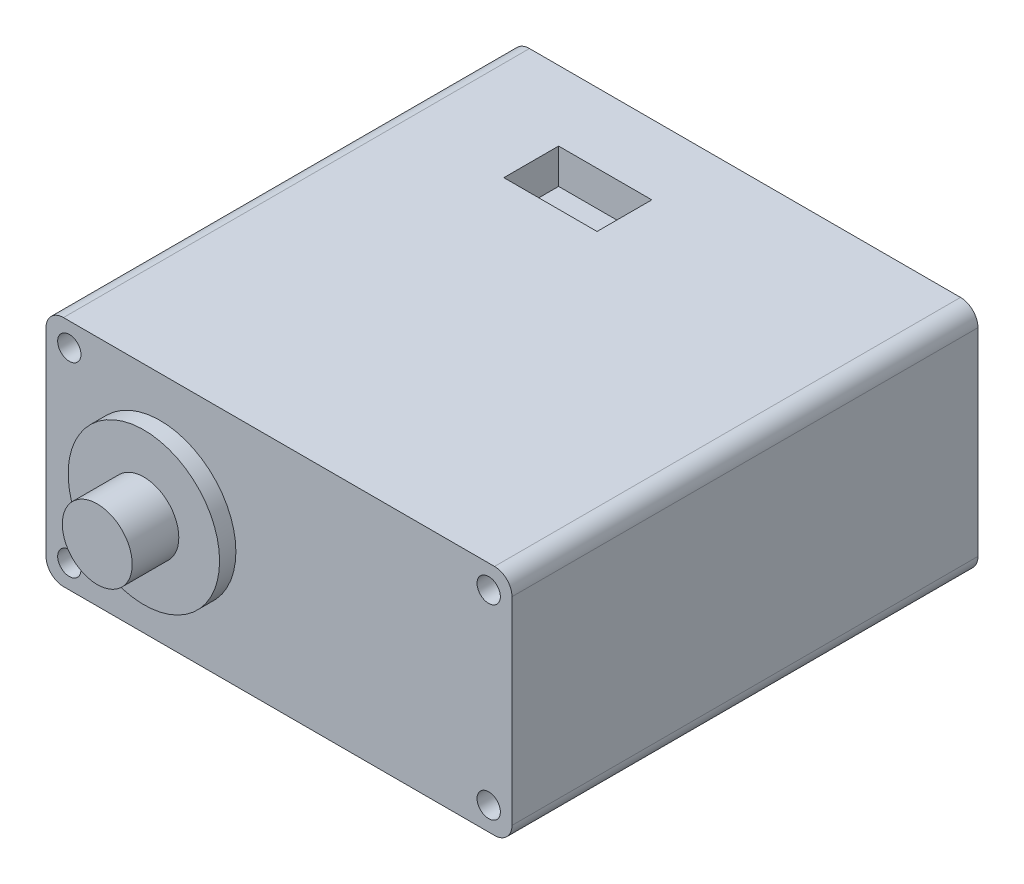
ISO-10303-21;
HEADER;
FILE_DESCRIPTION(('STEP AP214'),'2;1');
FILE_NAME('part.step','',(''),(''),'','','');
FILE_SCHEMA(('AUTOMOTIVE_DESIGN { 1 0 10303 214 1 1 1 1 }'));
ENDSEC;
DATA;
#1=APPLICATION_CONTEXT('core data for automotive mechanical design processes');
#2=APPLICATION_PROTOCOL_DEFINITION('international standard','automotive_design',2000,#1);
#3=PRODUCT_CONTEXT('',#1,'mechanical');
#4=PRODUCT('Part','Part','',(#3));
#5=PRODUCT_RELATED_PRODUCT_CATEGORY('part','',(#4));
#6=PRODUCT_DEFINITION_FORMATION('','',#4);
#7=PRODUCT_DEFINITION_CONTEXT('part definition',#1,'design');
#8=PRODUCT_DEFINITION('design','',#6,#7);
#9=PRODUCT_DEFINITION_SHAPE('','',#8);
#10=(LENGTH_UNIT() NAMED_UNIT(*) SI_UNIT(.MILLI.,.METRE.));
#11=(NAMED_UNIT(*) PLANE_ANGLE_UNIT() SI_UNIT($,.RADIAN.));
#12=(NAMED_UNIT(*) SI_UNIT($,.STERADIAN.) SOLID_ANGLE_UNIT());
#13=UNCERTAINTY_MEASURE_WITH_UNIT(LENGTH_MEASURE(1.E-05),#10,'distance_accuracy_value','');
#14=(GEOMETRIC_REPRESENTATION_CONTEXT(3) GLOBAL_UNCERTAINTY_ASSIGNED_CONTEXT((#13)) GLOBAL_UNIT_ASSIGNED_CONTEXT((#10,
#11,#12)) REPRESENTATION_CONTEXT('',''));
#15=CARTESIAN_POINT('',(0.,0.,0.));
#16=DIRECTION('',(0.,0.,1.));
#17=DIRECTION('',(1.,0.,0.));
#18=AXIS2_PLACEMENT_3D('',#15,#16,#17);
#19=CARTESIAN_POINT('',(-16.5753114594964,120.529011992891,40.));
#20=DIRECTION('',(0.,-1.,0.));
#21=DIRECTION('',(0.,0.,-1.));
#22=AXIS2_PLACEMENT_3D('',#19,#20,#21);
#23=PLANE('',#22);
#24=DIRECTION('',(-1.,0.,0.));
#25=VECTOR('',#24,1.);
#26=CARTESIAN_POINT('',(-16.5753114594964,120.529011992891,0.));
#27=LINE('',#26,#25);
#28=CARTESIAN_POINT('',(-18.0753114594964,120.529011992891,0.));
#29=VERTEX_POINT('',#28);
#30=CARTESIAN_POINT('',(-55.0753114594964,120.529011992891,0.));
#31=VERTEX_POINT('',#30);
#32=EDGE_CURVE('E332',#29,#31,#27,.T.);
#33=ORIENTED_EDGE('',*,*,#32,.T.);
#34=DIRECTION('',(0.,0.,-1.));
#35=VECTOR('',#34,1.);
#36=CARTESIAN_POINT('',(-55.0753114594964,120.529011992891,40.));
#37=LINE('',#36,#35);
#38=CARTESIAN_POINT('',(-55.0753114594964,120.529011992891,40.));
#39=VERTEX_POINT('',#38);
#40=EDGE_CURVE('E355',#31,#39,#37,.F.);
#41=ORIENTED_EDGE('',*,*,#40,.T.);
#42=DIRECTION('',(-1.,0.,0.));
#43=VECTOR('',#42,1.);
#44=CARTESIAN_POINT('',(-16.5753114594964,120.529011992891,40.));
#45=LINE('',#44,#43);
#46=CARTESIAN_POINT('',(-18.0753114594964,120.529011992891,40.));
#47=VERTEX_POINT('',#46);
#48=EDGE_CURVE('E319',#47,#39,#45,.T.);
#49=ORIENTED_EDGE('',*,*,#48,.F.);
#50=DIRECTION('',(0.,0.,-1.));
#51=VECTOR('',#50,1.);
#52=CARTESIAN_POINT('',(-18.0753114594964,120.529011992891,40.));
#53=LINE('',#52,#51);
#54=EDGE_CURVE('E352',#47,#29,#53,.T.);
#55=ORIENTED_EDGE('',*,*,#54,.T.);
#56=EDGE_LOOP('',(#33,#41,#49,#55));
#57=FACE_BOUND('',#56,.T.);
#58=DIRECTION('',(0.,0.,1.));
#59=VECTOR('',#58,1.);
#60=CARTESIAN_POINT('',(-38.5753114594964,120.529011992891,10.7));
#61=LINE('',#60,#59);
#62=CARTESIAN_POINT('',(-38.5753114594964,120.529011992891,6.));
#63=VERTEX_POINT('',#62);
#64=CARTESIAN_POINT('',(-38.5753114594964,120.529011992891,10.7));
#65=VERTEX_POINT('',#64);
#66=EDGE_CURVE('E66',#63,#65,#61,.T.);
#67=ORIENTED_EDGE('',*,*,#66,.T.);
#68=DIRECTION('',(-1.,0.,0.));
#69=VECTOR('',#68,1.);
#70=CARTESIAN_POINT('',(-46.5753114594964,120.529011992891,10.7));
#71=LINE('',#70,#69);
#72=CARTESIAN_POINT('',(-46.5753114594964,120.529011992891,10.7));
#73=VERTEX_POINT('',#72);
#74=EDGE_CURVE('E224',#65,#73,#71,.T.);
#75=ORIENTED_EDGE('',*,*,#74,.T.);
#76=DIRECTION('',(0.,0.,-1.));
#77=VECTOR('',#76,1.);
#78=CARTESIAN_POINT('',(-46.5753114594964,120.529011992891,10.7));
#79=LINE('',#78,#77);
#80=CARTESIAN_POINT('',(-46.5753114594964,120.529011992891,6.));
#81=VERTEX_POINT('',#80);
#82=EDGE_CURVE('E235',#73,#81,#79,.T.);
#83=ORIENTED_EDGE('',*,*,#82,.T.);
#84=DIRECTION('',(1.,0.,0.));
#85=VECTOR('',#84,1.);
#86=CARTESIAN_POINT('',(-46.5753114594964,120.529011992891,6.));
#87=LINE('',#86,#85);
#88=EDGE_CURVE('E232',#81,#63,#87,.T.);
#89=ORIENTED_EDGE('',*,*,#88,.T.);
#90=EDGE_LOOP('',(#67,#75,#83,#89));
#91=FACE_BOUND('',#90,.T.);
#92=ADVANCED_FACE('F42',(#57,#91),#23,.F.);
#93=CARTESIAN_POINT('',(0.,0.,40.));
#94=DIRECTION('',(0.,0.,1.));
#95=DIRECTION('',(1.,0.,0.));
#96=AXIS2_PLACEMENT_3D('',#93,#94,#95);
#97=PLANE('',#96);
#98=CARTESIAN_POINT('',(-46.7753114594964,110.529011992891,40.));
#99=DIRECTION('',(0.,0.,1.));
#100=DIRECTION('',(1.,0.,0.));
#101=AXIS2_PLACEMENT_3D('',#98,#99,#100);
#102=CIRCLE('',#101,6.5);
#103=CARTESIAN_POINT('',(-40.2753114594964,110.529011992891,40.));
#104=VERTEX_POINT('',#103);
#105=EDGE_CURVE('E285',#104,#104,#102,.T.);
#106=ORIENTED_EDGE('',*,*,#105,.F.);
#107=EDGE_LOOP('',(#106));
#108=FACE_BOUND('',#107,.T.);
#109=CARTESIAN_POINT('',(-18.5753114594964,102.529011992891,40.));
#110=DIRECTION('',(0.,0.,1.));
#111=DIRECTION('',(1.,0.,0.));
#112=AXIS2_PLACEMENT_3D('',#109,#110,#111);
#113=CIRCLE('',#112,0.999999999999998);
#114=CARTESIAN_POINT('',(-17.5753114594964,102.529011992891,40.));
#115=VERTEX_POINT('',#114);
#116=EDGE_CURVE('E298',#115,#115,#113,.T.);
#117=ORIENTED_EDGE('',*,*,#116,.F.);
#118=EDGE_LOOP('',(#117));
#119=FACE_BOUND('',#118,.T.);
#120=CARTESIAN_POINT('',(-54.5753114594964,118.529011992891,40.));
#121=DIRECTION('',(0.,0.,1.));
#122=DIRECTION('',(1.,0.,0.));
#123=AXIS2_PLACEMENT_3D('',#120,#121,#122);
#124=CIRCLE('',#123,0.999999999999998);
#125=CARTESIAN_POINT('',(-53.5753114594964,118.529011992891,40.));
#126=VERTEX_POINT('',#125);
#127=EDGE_CURVE('E310',#126,#126,#124,.T.);
#128=ORIENTED_EDGE('',*,*,#127,.F.);
#129=EDGE_LOOP('',(#128));
#130=FACE_BOUND('',#129,.T.);
#131=ORIENTED_EDGE('',*,*,#48,.T.);
#132=CARTESIAN_POINT('',(-55.0753114594964,119.029011992891,40.));
#133=DIRECTION('',(0.,0.,1.));
#134=DIRECTION('',(1.,0.,0.));
#135=AXIS2_PLACEMENT_3D('',#132,#133,#134);
#136=CIRCLE('',#135,1.5);
#137=CARTESIAN_POINT('',(-56.5753114594964,119.029011992891,40.));
#138=VERTEX_POINT('',#137);
#139=EDGE_CURVE('E363',#39,#138,#136,.T.);
#140=ORIENTED_EDGE('',*,*,#139,.T.);
#141=DIRECTION('',(0.,-1.,0.));
#142=VECTOR('',#141,1.);
#143=CARTESIAN_POINT('',(-56.5753114594964,100.529011992891,40.));
#144=LINE('',#143,#142);
#145=CARTESIAN_POINT('',(-56.5753114594964,102.029011992891,40.));
#146=VERTEX_POINT('',#145);
#147=EDGE_CURVE('E323',#138,#146,#144,.T.);
#148=ORIENTED_EDGE('',*,*,#147,.T.);
#149=CARTESIAN_POINT('',(-55.0753114594964,102.029011992891,40.));
#150=DIRECTION('',(0.,0.,1.));
#151=DIRECTION('',(1.,0.,0.));
#152=AXIS2_PLACEMENT_3D('',#149,#150,#151);
#153=CIRCLE('',#152,1.5);
#154=CARTESIAN_POINT('',(-55.0753114594964,100.529011992891,40.));
#155=VERTEX_POINT('',#154);
#156=EDGE_CURVE('E357',#146,#155,#153,.T.);
#157=ORIENTED_EDGE('',*,*,#156,.T.);
#158=DIRECTION('',(1.,0.,0.));
#159=VECTOR('',#158,1.);
#160=CARTESIAN_POINT('',(-16.5753114594964,100.529011992891,40.));
#161=LINE('',#160,#159);
#162=CARTESIAN_POINT('',(-18.0753114594964,100.529011992891,40.));
#163=VERTEX_POINT('',#162);
#164=EDGE_CURVE('E326',#155,#163,#161,.T.);
#165=ORIENTED_EDGE('',*,*,#164,.T.);
#166=CARTESIAN_POINT('',(-18.0753114594964,102.029011992891,40.));
#167=DIRECTION('',(0.,0.,1.));
#168=DIRECTION('',(1.,0.,0.));
#169=AXIS2_PLACEMENT_3D('',#166,#167,#168);
#170=CIRCLE('',#169,1.5);
#171=CARTESIAN_POINT('',(-16.5753114594964,102.029011992891,40.));
#172=VERTEX_POINT('',#171);
#173=EDGE_CURVE('E359',#163,#172,#170,.T.);
#174=ORIENTED_EDGE('',*,*,#173,.T.);
#175=DIRECTION('',(0.,1.,0.));
#176=VECTOR('',#175,1.);
#177=CARTESIAN_POINT('',(-16.5753114594964,100.529011992891,40.));
#178=LINE('',#177,#176);
#179=CARTESIAN_POINT('',(-16.5753114594964,119.029011992891,40.));
#180=VERTEX_POINT('',#179);
#181=EDGE_CURVE('E316',#172,#180,#178,.T.);
#182=ORIENTED_EDGE('',*,*,#181,.T.);
#183=CARTESIAN_POINT('',(-18.0753114594964,119.029011992891,40.));
#184=DIRECTION('',(0.,0.,1.));
#185=DIRECTION('',(1.,0.,0.));
#186=AXIS2_PLACEMENT_3D('',#183,#184,#185);
#187=CIRCLE('',#186,1.5);
#188=EDGE_CURVE('E361',#180,#47,#187,.T.);
#189=ORIENTED_EDGE('',*,*,#188,.T.);
#190=EDGE_LOOP('',(#131,#140,#148,#157,#165,#174,#182,#189));
#191=FACE_BOUND('',#190,.T.);
#192=CARTESIAN_POINT('',(-54.5753114594964,102.529011992891,40.));
#193=DIRECTION('',(0.,0.,1.));
#194=DIRECTION('',(1.,0.,0.));
#195=AXIS2_PLACEMENT_3D('',#192,#193,#194);
#196=CIRCLE('',#195,0.999999999999998);
#197=CARTESIAN_POINT('',(-53.5753114594964,102.529011992891,40.));
#198=VERTEX_POINT('',#197);
#199=EDGE_CURVE('E304',#198,#198,#196,.T.);
#200=ORIENTED_EDGE('',*,*,#199,.F.);
#201=EDGE_LOOP('',(#200));
#202=FACE_BOUND('',#201,.T.);
#203=CARTESIAN_POINT('',(-18.5753114594964,118.529011992891,40.));
#204=DIRECTION('',(0.,0.,1.));
#205=DIRECTION('',(1.,0.,0.));
#206=AXIS2_PLACEMENT_3D('',#203,#204,#205);
#207=CIRCLE('',#206,0.999999999999998);
#208=CARTESIAN_POINT('',(-17.5753114594964,118.529011992891,40.));
#209=VERTEX_POINT('',#208);
#210=EDGE_CURVE('E292',#209,#209,#207,.T.);
#211=ORIENTED_EDGE('',*,*,#210,.F.);
#212=EDGE_LOOP('',(#211));
#213=FACE_BOUND('',#212,.T.);
#214=ADVANCED_FACE('F385',(#108,#119,#130,#191,#202,#213),#97,.T.);
#215=CARTESIAN_POINT('',(0.,0.,0.));
#216=DIRECTION('',(0.,0.,1.));
#217=DIRECTION('',(1.,0.,0.));
#218=AXIS2_PLACEMENT_3D('',#215,#216,#217);
#219=PLANE('',#218);
#220=CARTESIAN_POINT('',(-46.7753114594964,110.529011992891,0.));
#221=DIRECTION('',(0.,0.,1.));
#222=DIRECTION('',(1.,0.,0.));
#223=AXIS2_PLACEMENT_3D('',#220,#221,#222);
#224=CIRCLE('',#223,6.50000000000001);
#225=CARTESIAN_POINT('',(-40.2753114594964,110.529011992891,0.));
#226=VERTEX_POINT('',#225);
#227=EDGE_CURVE('E46',#226,#226,#224,.F.);
#228=ORIENTED_EDGE('',*,*,#227,.F.);
#229=EDGE_LOOP('',(#228));
#230=FACE_BOUND('',#229,.T.);
#231=DIRECTION('',(0.,-1.,0.));
#232=VECTOR('',#231,1.);
#233=CARTESIAN_POINT('',(-56.5753114594964,100.529011992891,0.));
#234=LINE('',#233,#232);
#235=CARTESIAN_POINT('',(-56.5753114594964,119.029011992891,0.));
#236=VERTEX_POINT('',#235);
#237=CARTESIAN_POINT('',(-56.5753114594964,102.029011992891,0.));
#238=VERTEX_POINT('',#237);
#239=EDGE_CURVE('E335',#236,#238,#234,.T.);
#240=ORIENTED_EDGE('',*,*,#239,.F.);
#241=CARTESIAN_POINT('',(-55.0753114594964,119.029011992891,0.));
#242=DIRECTION('',(0.,0.,1.));
#243=DIRECTION('',(1.,0.,0.));
#244=AXIS2_PLACEMENT_3D('',#241,#242,#243);
#245=CIRCLE('',#244,1.5);
#246=EDGE_CURVE('E350',#236,#31,#245,.F.);
#247=ORIENTED_EDGE('',*,*,#246,.T.);
#248=ORIENTED_EDGE('',*,*,#32,.F.);
#249=CARTESIAN_POINT('',(-18.0753114594964,119.029011992891,0.));
#250=DIRECTION('',(0.,0.,1.));
#251=DIRECTION('',(1.,0.,0.));
#252=AXIS2_PLACEMENT_3D('',#249,#250,#251);
#253=CIRCLE('',#252,1.5);
#254=CARTESIAN_POINT('',(-16.5753114594964,119.029011992891,0.));
#255=VERTEX_POINT('',#254);
#256=EDGE_CURVE('E348',#29,#255,#253,.F.);
#257=ORIENTED_EDGE('',*,*,#256,.T.);
#258=DIRECTION('',(0.,1.,0.));
#259=VECTOR('',#258,1.);
#260=CARTESIAN_POINT('',(-16.5753114594964,100.529011992891,0.));
#261=LINE('',#260,#259);
#262=CARTESIAN_POINT('',(-16.5753114594964,102.029011992891,0.));
#263=VERTEX_POINT('',#262);
#264=EDGE_CURVE('E313',#263,#255,#261,.T.);
#265=ORIENTED_EDGE('',*,*,#264,.F.);
#266=CARTESIAN_POINT('',(-18.0753114594964,102.029011992891,0.));
#267=DIRECTION('',(0.,0.,1.));
#268=DIRECTION('',(1.,0.,0.));
#269=AXIS2_PLACEMENT_3D('',#266,#267,#268);
#270=CIRCLE('',#269,1.5);
#271=CARTESIAN_POINT('',(-18.0753114594964,100.529011992891,0.));
#272=VERTEX_POINT('',#271);
#273=EDGE_CURVE('E346',#263,#272,#270,.F.);
#274=ORIENTED_EDGE('',*,*,#273,.T.);
#275=DIRECTION('',(1.,0.,0.));
#276=VECTOR('',#275,1.);
#277=CARTESIAN_POINT('',(-16.5753114594964,100.529011992891,0.));
#278=LINE('',#277,#276);
#279=CARTESIAN_POINT('',(-55.0753114594964,100.529011992891,0.));
#280=VERTEX_POINT('',#279);
#281=EDGE_CURVE('E320',#280,#272,#278,.T.);
#282=ORIENTED_EDGE('',*,*,#281,.F.);
#283=CARTESIAN_POINT('',(-55.0753114594964,102.029011992891,0.));
#284=DIRECTION('',(0.,0.,1.));
#285=DIRECTION('',(1.,0.,0.));
#286=AXIS2_PLACEMENT_3D('',#283,#284,#285);
#287=CIRCLE('',#286,1.5);
#288=EDGE_CURVE('E344',#280,#238,#287,.F.);
#289=ORIENTED_EDGE('',*,*,#288,.T.);
#290=EDGE_LOOP('',(#240,#247,#248,#257,#265,#274,#282,#289));
#291=FACE_BOUND('',#290,.T.);
#292=CARTESIAN_POINT('',(-54.5753114594964,118.529011992891,0.));
#293=DIRECTION('',(0.,0.,1.));
#294=DIRECTION('',(1.,0.,0.));
#295=AXIS2_PLACEMENT_3D('',#292,#293,#294);
#296=CIRCLE('',#295,0.999999999999998);
#297=CARTESIAN_POINT('',(-53.5753114594964,118.529011992891,0.));
#298=VERTEX_POINT('',#297);
#299=EDGE_CURVE('E307',#298,#298,#296,.T.);
#300=ORIENTED_EDGE('',*,*,#299,.T.);
#301=EDGE_LOOP('',(#300));
#302=FACE_BOUND('',#301,.T.);
#303=CARTESIAN_POINT('',(-54.5753114594964,102.529011992891,0.));
#304=DIRECTION('',(0.,0.,1.));
#305=DIRECTION('',(1.,0.,0.));
#306=AXIS2_PLACEMENT_3D('',#303,#304,#305);
#307=CIRCLE('',#306,0.999999999999998);
#308=CARTESIAN_POINT('',(-53.5753114594964,102.529011992891,0.));
#309=VERTEX_POINT('',#308);
#310=EDGE_CURVE('E301',#309,#309,#307,.T.);
#311=ORIENTED_EDGE('',*,*,#310,.T.);
#312=EDGE_LOOP('',(#311));
#313=FACE_BOUND('',#312,.T.);
#314=CARTESIAN_POINT('',(-18.5753114594964,102.529011992891,0.));
#315=DIRECTION('',(0.,0.,1.));
#316=DIRECTION('',(1.,0.,0.));
#317=AXIS2_PLACEMENT_3D('',#314,#315,#316);
#318=CIRCLE('',#317,0.999999999999998);
#319=CARTESIAN_POINT('',(-17.5753114594964,102.529011992891,0.));
#320=VERTEX_POINT('',#319);
#321=EDGE_CURVE('E295',#320,#320,#318,.T.);
#322=ORIENTED_EDGE('',*,*,#321,.T.);
#323=EDGE_LOOP('',(#322));
#324=FACE_BOUND('',#323,.T.);
#325=CARTESIAN_POINT('',(-18.5753114594964,118.529011992891,0.));
#326=DIRECTION('',(0.,0.,1.));
#327=DIRECTION('',(1.,0.,0.));
#328=AXIS2_PLACEMENT_3D('',#325,#326,#327);
#329=CIRCLE('',#328,0.999999999999998);
#330=CARTESIAN_POINT('',(-17.5753114594964,118.529011992891,0.));
#331=VERTEX_POINT('',#330);
#332=EDGE_CURVE('E289',#331,#331,#329,.T.);
#333=ORIENTED_EDGE('',*,*,#332,.T.);
#334=EDGE_LOOP('',(#333));
#335=FACE_BOUND('',#334,.T.);
#336=ADVANCED_FACE('F381',(#230,#291,#302,#313,#324,#335),#219,.F.);
#337=CARTESIAN_POINT('',(-16.5753114594964,100.529011992891,40.));
#338=DIRECTION('',(-1.,0.,0.));
#339=DIRECTION('',(0.,0.,1.));
#340=AXIS2_PLACEMENT_3D('',#337,#338,#339);
#341=PLANE('',#340);
#342=ORIENTED_EDGE('',*,*,#264,.T.);
#343=DIRECTION('',(0.,0.,-1.));
#344=VECTOR('',#343,1.);
#345=CARTESIAN_POINT('',(-16.5753114594964,119.029011992891,40.));
#346=LINE('',#345,#344);
#347=EDGE_CURVE('E368',#255,#180,#346,.F.);
#348=ORIENTED_EDGE('',*,*,#347,.T.);
#349=ORIENTED_EDGE('',*,*,#181,.F.);
#350=DIRECTION('',(0.,0.,-1.));
#351=VECTOR('',#350,1.);
#352=CARTESIAN_POINT('',(-16.5753114594964,102.029011992891,40.));
#353=LINE('',#352,#351);
#354=EDGE_CURVE('E365',#172,#263,#353,.T.);
#355=ORIENTED_EDGE('',*,*,#354,.T.);
#356=EDGE_LOOP('',(#342,#348,#349,#355));
#357=FACE_BOUND('',#356,.T.);
#358=ADVANCED_FACE('F384',(#357),#341,.F.);
#359=CARTESIAN_POINT('',(-56.5753114594964,100.529011992891,40.));
#360=DIRECTION('',(1.,0.,0.));
#361=DIRECTION('',(0.,0.,-1.));
#362=AXIS2_PLACEMENT_3D('',#359,#360,#361);
#363=PLANE('',#362);
#364=DIRECTION('',(0.,0.,-1.));
#365=VECTOR('',#364,1.);
#366=CARTESIAN_POINT('',(-56.5753114594964,114.529011992891,6.));
#367=LINE('',#366,#365);
#368=CARTESIAN_POINT('',(-56.5753114594964,114.529011992891,10.7));
#369=VERTEX_POINT('',#368);
#370=CARTESIAN_POINT('',(-56.5753114594964,114.529011992891,6.));
#371=VERTEX_POINT('',#370);
#372=EDGE_CURVE('E211',#369,#371,#367,.T.);
#373=ORIENTED_EDGE('',*,*,#372,.F.);
#374=DIRECTION('',(0.,1.,0.));
#375=VECTOR('',#374,1.);
#376=CARTESIAN_POINT('',(-56.5753114594964,114.529011992891,10.7));
#377=LINE('',#376,#375);
#378=CARTESIAN_POINT('',(-56.5753114594964,106.529011992891,10.7));
#379=VERTEX_POINT('',#378);
#380=EDGE_CURVE('E58',#379,#369,#377,.T.);
#381=ORIENTED_EDGE('',*,*,#380,.F.);
#382=DIRECTION('',(0.,0.,1.));
#383=VECTOR('',#382,1.);
#384=CARTESIAN_POINT('',(-56.5753114594964,106.529011992891,6.));
#385=LINE('',#384,#383);
#386=CARTESIAN_POINT('',(-56.5753114594964,106.529011992891,6.));
#387=VERTEX_POINT('',#386);
#388=EDGE_CURVE('E202',#387,#379,#385,.T.);
#389=ORIENTED_EDGE('',*,*,#388,.F.);
#390=DIRECTION('',(0.,-1.,0.));
#391=VECTOR('',#390,1.);
#392=CARTESIAN_POINT('',(-56.5753114594964,114.529011992891,6.));
#393=LINE('',#392,#391);
#394=EDGE_CURVE('E205',#371,#387,#393,.T.);
#395=ORIENTED_EDGE('',*,*,#394,.F.);
#396=EDGE_LOOP('',(#373,#381,#389,#395));
#397=FACE_BOUND('',#396,.T.);
#398=ORIENTED_EDGE('',*,*,#147,.F.);
#399=DIRECTION('',(0.,0.,-1.));
#400=VECTOR('',#399,1.);
#401=CARTESIAN_POINT('',(-56.5753114594964,119.029011992891,40.));
#402=LINE('',#401,#400);
#403=EDGE_CURVE('E341',#138,#236,#402,.T.);
#404=ORIENTED_EDGE('',*,*,#403,.T.);
#405=ORIENTED_EDGE('',*,*,#239,.T.);
#406=DIRECTION('',(0.,0.,-1.));
#407=VECTOR('',#406,1.);
#408=CARTESIAN_POINT('',(-56.5753114594964,102.029011992891,40.));
#409=LINE('',#408,#407);
#410=EDGE_CURVE('E329',#238,#146,#409,.F.);
#411=ORIENTED_EDGE('',*,*,#410,.T.);
#412=EDGE_LOOP('',(#398,#404,#405,#411));
#413=FACE_BOUND('',#412,.T.);
#414=ADVANCED_FACE('F425',(#397,#413),#363,.F.);
#415=CARTESIAN_POINT('',(-16.5753114594964,100.529011992891,40.));
#416=DIRECTION('',(0.,1.,0.));
#417=DIRECTION('',(0.,0.,1.));
#418=AXIS2_PLACEMENT_3D('',#415,#416,#417);
#419=PLANE('',#418);
#420=DIRECTION('',(-1.,0.,0.));
#421=VECTOR('',#420,1.);
#422=CARTESIAN_POINT('',(-46.5753114594964,100.529011992891,10.7));
#423=LINE('',#422,#421);
#424=CARTESIAN_POINT('',(-38.5753114594964,100.529011992891,10.7));
#425=VERTEX_POINT('',#424);
#426=CARTESIAN_POINT('',(-46.5753114594964,100.529011992891,10.7));
#427=VERTEX_POINT('',#426);
#428=EDGE_CURVE('E263',#425,#427,#423,.T.);
#429=ORIENTED_EDGE('',*,*,#428,.F.);
#430=DIRECTION('',(0.,0.,1.));
#431=VECTOR('',#430,1.);
#432=CARTESIAN_POINT('',(-38.5753114594964,100.529011992891,10.7));
#433=LINE('',#432,#431);
#434=CARTESIAN_POINT('',(-38.5753114594964,100.529011992891,6.));
#435=VERTEX_POINT('',#434);
#436=EDGE_CURVE('E242',#435,#425,#433,.T.);
#437=ORIENTED_EDGE('',*,*,#436,.F.);
#438=DIRECTION('',(1.,0.,0.));
#439=VECTOR('',#438,1.);
#440=CARTESIAN_POINT('',(-46.5753114594964,100.529011992891,6.));
#441=LINE('',#440,#439);
#442=CARTESIAN_POINT('',(-46.5753114594964,100.529011992891,6.));
#443=VERTEX_POINT('',#442);
#444=EDGE_CURVE('E252',#443,#435,#441,.T.);
#445=ORIENTED_EDGE('',*,*,#444,.F.);
#446=DIRECTION('',(0.,0.,-1.));
#447=VECTOR('',#446,1.);
#448=CARTESIAN_POINT('',(-46.5753114594964,100.529011992891,10.7));
#449=LINE('',#448,#447);
#450=EDGE_CURVE('E266',#427,#443,#449,.T.);
#451=ORIENTED_EDGE('',*,*,#450,.F.);
#452=EDGE_LOOP('',(#429,#437,#445,#451));
#453=FACE_BOUND('',#452,.T.);
#454=ORIENTED_EDGE('',*,*,#281,.T.);
#455=DIRECTION('',(0.,0.,-1.));
#456=VECTOR('',#455,1.);
#457=CARTESIAN_POINT('',(-18.0753114594964,100.529011992891,40.));
#458=LINE('',#457,#456);
#459=EDGE_CURVE('E372',#272,#163,#458,.F.);
#460=ORIENTED_EDGE('',*,*,#459,.T.);
#461=ORIENTED_EDGE('',*,*,#164,.F.);
#462=DIRECTION('',(0.,0.,-1.));
#463=VECTOR('',#462,1.);
#464=CARTESIAN_POINT('',(-55.0753114594964,100.529011992891,40.));
#465=LINE('',#464,#463);
#466=EDGE_CURVE('E370',#155,#280,#465,.T.);
#467=ORIENTED_EDGE('',*,*,#466,.T.);
#468=EDGE_LOOP('',(#454,#460,#461,#467));
#469=FACE_BOUND('',#468,.T.);
#470=ADVANCED_FACE('F459',(#453,#469),#419,.F.);
#471=CARTESIAN_POINT('',(-54.5753114594964,118.529011992891,40.));
#472=DIRECTION('',(0.,0.,-1.));
#473=DIRECTION('',(-1.,0.,0.));
#474=AXIS2_PLACEMENT_3D('',#471,#472,#473);
#475=CYLINDRICAL_SURFACE('',#474,0.999999999999998);
#476=ORIENTED_EDGE('',*,*,#127,.T.);
#477=EDGE_LOOP('',(#476));
#478=FACE_BOUND('',#477,.T.);
#479=ORIENTED_EDGE('',*,*,#299,.F.);
#480=EDGE_LOOP('',(#479));
#481=FACE_BOUND('',#480,.T.);
#482=ADVANCED_FACE('F462',(#478,#481),#475,.F.);
#483=CARTESIAN_POINT('',(-54.5753114594964,102.529011992891,40.));
#484=DIRECTION('',(0.,0.,-1.));
#485=DIRECTION('',(-1.,0.,0.));
#486=AXIS2_PLACEMENT_3D('',#483,#484,#485);
#487=CYLINDRICAL_SURFACE('',#486,0.999999999999998);
#488=ORIENTED_EDGE('',*,*,#199,.T.);
#489=EDGE_LOOP('',(#488));
#490=FACE_BOUND('',#489,.T.);
#491=ORIENTED_EDGE('',*,*,#310,.F.);
#492=EDGE_LOOP('',(#491));
#493=FACE_BOUND('',#492,.T.);
#494=ADVANCED_FACE('F410',(#490,#493),#487,.F.);
#495=CARTESIAN_POINT('',(-18.5753114594964,102.529011992891,40.));
#496=DIRECTION('',(0.,0.,-1.));
#497=DIRECTION('',(-1.,0.,0.));
#498=AXIS2_PLACEMENT_3D('',#495,#496,#497);
#499=CYLINDRICAL_SURFACE('',#498,0.999999999999998);
#500=ORIENTED_EDGE('',*,*,#116,.T.);
#501=EDGE_LOOP('',(#500));
#502=FACE_BOUND('',#501,.T.);
#503=ORIENTED_EDGE('',*,*,#321,.F.);
#504=EDGE_LOOP('',(#503));
#505=FACE_BOUND('',#504,.T.);
#506=ADVANCED_FACE('F400',(#502,#505),#499,.F.);
#507=CARTESIAN_POINT('',(-18.5753114594964,118.529011992891,40.));
#508=DIRECTION('',(0.,0.,-1.));
#509=DIRECTION('',(-1.,0.,0.));
#510=AXIS2_PLACEMENT_3D('',#507,#508,#509);
#511=CYLINDRICAL_SURFACE('',#510,0.999999999999998);
#512=ORIENTED_EDGE('',*,*,#210,.T.);
#513=EDGE_LOOP('',(#512));
#514=FACE_BOUND('',#513,.T.);
#515=ORIENTED_EDGE('',*,*,#332,.F.);
#516=EDGE_LOOP('',(#515));
#517=FACE_BOUND('',#516,.T.);
#518=ADVANCED_FACE('F397',(#514,#517),#511,.F.);
#519=CARTESIAN_POINT('',(-55.0753114594964,119.029011992891,40.));
#520=DIRECTION('',(0.,0.,-1.));
#521=DIRECTION('',(-1.,0.,0.));
#522=AXIS2_PLACEMENT_3D('',#519,#520,#521);
#523=CYLINDRICAL_SURFACE('',#522,1.5);
#524=ORIENTED_EDGE('',*,*,#139,.F.);
#525=ORIENTED_EDGE('',*,*,#40,.F.);
#526=ORIENTED_EDGE('',*,*,#246,.F.);
#527=ORIENTED_EDGE('',*,*,#403,.F.);
#528=EDGE_LOOP('',(#524,#525,#526,#527));
#529=FACE_BOUND('',#528,.T.);
#530=ADVANCED_FACE('F399',(#529),#523,.T.);
#531=CARTESIAN_POINT('',(-18.0753114594964,119.029011992891,40.));
#532=DIRECTION('',(0.,0.,-1.));
#533=DIRECTION('',(-1.,0.,0.));
#534=AXIS2_PLACEMENT_3D('',#531,#532,#533);
#535=CYLINDRICAL_SURFACE('',#534,1.5);
#536=ORIENTED_EDGE('',*,*,#188,.F.);
#537=ORIENTED_EDGE('',*,*,#347,.F.);
#538=ORIENTED_EDGE('',*,*,#256,.F.);
#539=ORIENTED_EDGE('',*,*,#54,.F.);
#540=EDGE_LOOP('',(#536,#537,#538,#539));
#541=FACE_BOUND('',#540,.T.);
#542=ADVANCED_FACE('F407',(#541),#535,.T.);
#543=CARTESIAN_POINT('',(-18.0753114594964,102.029011992891,40.));
#544=DIRECTION('',(0.,0.,-1.));
#545=DIRECTION('',(-1.,0.,0.));
#546=AXIS2_PLACEMENT_3D('',#543,#544,#545);
#547=CYLINDRICAL_SURFACE('',#546,1.5);
#548=ORIENTED_EDGE('',*,*,#173,.F.);
#549=ORIENTED_EDGE('',*,*,#459,.F.);
#550=ORIENTED_EDGE('',*,*,#273,.F.);
#551=ORIENTED_EDGE('',*,*,#354,.F.);
#552=EDGE_LOOP('',(#548,#549,#550,#551));
#553=FACE_BOUND('',#552,.T.);
#554=ADVANCED_FACE('F431',(#553),#547,.T.);
#555=CARTESIAN_POINT('',(-55.0753114594964,102.029011992891,40.));
#556=DIRECTION('',(0.,0.,-1.));
#557=DIRECTION('',(-1.,0.,0.));
#558=AXIS2_PLACEMENT_3D('',#555,#556,#557);
#559=CYLINDRICAL_SURFACE('',#558,1.5);
#560=ORIENTED_EDGE('',*,*,#156,.F.);
#561=ORIENTED_EDGE('',*,*,#410,.F.);
#562=ORIENTED_EDGE('',*,*,#288,.F.);
#563=ORIENTED_EDGE('',*,*,#466,.F.);
#564=EDGE_LOOP('',(#560,#561,#562,#563));
#565=FACE_BOUND('',#564,.T.);
#566=ADVANCED_FACE('F44',(#565),#559,.T.);
#567=CARTESIAN_POINT('',(-46.7753114594964,110.529011992891,41.4));
#568=DIRECTION('',(0.,0.,-1.));
#569=DIRECTION('',(-1.,0.,0.));
#570=AXIS2_PLACEMENT_3D('',#567,#568,#569);
#571=CYLINDRICAL_SURFACE('',#570,6.5);
#572=CARTESIAN_POINT('',(-46.7753114594964,110.529011992891,41.4));
#573=DIRECTION('',(0.,0.,1.));
#574=DIRECTION('',(1.,0.,0.));
#575=AXIS2_PLACEMENT_3D('',#572,#573,#574);
#576=CIRCLE('',#575,6.5);
#577=CARTESIAN_POINT('',(-40.2753114594964,110.529011992891,41.4));
#578=VERTEX_POINT('',#577);
#579=EDGE_CURVE('E286',#578,#578,#576,.T.);
#580=ORIENTED_EDGE('',*,*,#579,.F.);
#581=EDGE_LOOP('',(#580));
#582=FACE_BOUND('',#581,.T.);
#583=ORIENTED_EDGE('',*,*,#105,.T.);
#584=EDGE_LOOP('',(#583));
#585=FACE_BOUND('',#584,.T.);
#586=ADVANCED_FACE('F438',(#582,#585),#571,.T.);
#587=CARTESIAN_POINT('',(0.,0.,41.4));
#588=DIRECTION('',(0.,0.,1.));
#589=DIRECTION('',(1.,0.,0.));
#590=AXIS2_PLACEMENT_3D('',#587,#588,#589);
#591=PLANE('',#590);
#592=CARTESIAN_POINT('',(-46.7753114594964,110.529011992891,41.4));
#593=DIRECTION('',(0.,0.,1.));
#594=DIRECTION('',(1.,0.,0.));
#595=AXIS2_PLACEMENT_3D('',#592,#593,#594);
#596=CIRCLE('',#595,3.);
#597=CARTESIAN_POINT('',(-43.7753114594964,110.529011992891,41.4));
#598=VERTEX_POINT('',#597);
#599=EDGE_CURVE('E11',#598,#598,#596,.T.);
#600=ORIENTED_EDGE('',*,*,#599,.F.);
#601=EDGE_LOOP('',(#600));
#602=FACE_BOUND('',#601,.T.);
#603=ORIENTED_EDGE('',*,*,#579,.T.);
#604=EDGE_LOOP('',(#603));
#605=FACE_BOUND('',#604,.T.);
#606=ADVANCED_FACE('F544',(#602,#605),#591,.T.);
#607=CARTESIAN_POINT('',(-46.7753114594964,110.529011992891,-1.4));
#608=DIRECTION('',(0.,0.,1.));
#609=DIRECTION('',(1.,0.,0.));
#610=AXIS2_PLACEMENT_3D('',#607,#608,#609);
#611=CYLINDRICAL_SURFACE('',#610,6.50000000000001);
#612=CARTESIAN_POINT('',(-46.7753114594964,110.529011992891,-1.4));
#613=DIRECTION('',(0.,0.,-1.));
#614=DIRECTION('',(-1.,0.,0.));
#615=AXIS2_PLACEMENT_3D('',#612,#613,#614);
#616=CIRCLE('',#615,6.50000000000001);
#617=CARTESIAN_POINT('',(-53.2753114594964,110.529011992891,-1.4));
#618=VERTEX_POINT('',#617);
#619=EDGE_CURVE('E281',#618,#618,#616,.T.);
#620=ORIENTED_EDGE('',*,*,#619,.F.);
#621=EDGE_LOOP('',(#620));
#622=FACE_BOUND('',#621,.T.);
#623=ORIENTED_EDGE('',*,*,#227,.T.);
#624=EDGE_LOOP('',(#623));
#625=FACE_BOUND('',#624,.T.);
#626=ADVANCED_FACE('F379',(#622,#625),#611,.T.);
#627=CARTESIAN_POINT('',(-46.7753114594964,110.529011992891,-1.4));
#628=DIRECTION('',(0.,0.,-1.));
#629=DIRECTION('',(-1.,0.,0.));
#630=AXIS2_PLACEMENT_3D('',#627,#628,#629);
#631=PLANE('',#630);
#632=ORIENTED_EDGE('',*,*,#619,.T.);
#633=EDGE_LOOP('',(#632));
#634=FACE_BOUND('',#633,.T.);
#635=ADVANCED_FACE('F562',(#634),#631,.T.);
#636=CARTESIAN_POINT('',(-46.7753114594964,110.529011992891,45.4));
#637=DIRECTION('',(0.,0.,-1.));
#638=DIRECTION('',(-1.,0.,0.));
#639=AXIS2_PLACEMENT_3D('',#636,#637,#638);
#640=CYLINDRICAL_SURFACE('',#639,3.);
#641=CARTESIAN_POINT('',(-46.7753114594964,110.529011992891,45.4));
#642=DIRECTION('',(0.,0.,1.));
#643=DIRECTION('',(1.,0.,0.));
#644=AXIS2_PLACEMENT_3D('',#641,#642,#643);
#645=CIRCLE('',#644,3.);
#646=CARTESIAN_POINT('',(-43.7753114594964,110.529011992891,45.4));
#647=VERTEX_POINT('',#646);
#648=EDGE_CURVE('E273',#647,#647,#645,.T.);
#649=ORIENTED_EDGE('',*,*,#648,.F.);
#650=EDGE_LOOP('',(#649));
#651=FACE_BOUND('',#650,.T.);
#652=ORIENTED_EDGE('',*,*,#599,.T.);
#653=EDGE_LOOP('',(#652));
#654=FACE_BOUND('',#653,.T.);
#655=ADVANCED_FACE('F573',(#651,#654),#640,.T.);
#656=CARTESIAN_POINT('',(0.,0.,45.4));
#657=DIRECTION('',(0.,0.,1.));
#658=DIRECTION('',(1.,0.,0.));
#659=AXIS2_PLACEMENT_3D('',#656,#657,#658);
#660=PLANE('',#659);
#661=ORIENTED_EDGE('',*,*,#648,.T.);
#662=EDGE_LOOP('',(#661));
#663=FACE_BOUND('',#662,.T.);
#664=ADVANCED_FACE('F592',(#663),#660,.T.);
#665=CARTESIAN_POINT('',(-38.5753114594964,103.529011992891,10.7));
#666=DIRECTION('',(1.,0.,0.));
#667=DIRECTION('',(0.,0.,-1.));
#668=AXIS2_PLACEMENT_3D('',#665,#666,#667);
#669=PLANE('',#668);
#670=ORIENTED_EDGE('',*,*,#436,.T.);
#671=DIRECTION('',(0.,-1.,0.));
#672=VECTOR('',#671,1.);
#673=CARTESIAN_POINT('',(-38.5753114594964,103.529011992891,10.7));
#674=LINE('',#673,#672);
#675=CARTESIAN_POINT('',(-38.5753114594964,103.529011992891,10.7));
#676=VERTEX_POINT('',#675);
#677=EDGE_CURVE('E261',#676,#425,#674,.T.);
#678=ORIENTED_EDGE('',*,*,#677,.F.);
#679=DIRECTION('',(0.,0.,1.));
#680=VECTOR('',#679,1.);
#681=CARTESIAN_POINT('',(-38.5753114594964,103.529011992891,10.7));
#682=LINE('',#681,#680);
#683=CARTESIAN_POINT('',(-38.5753114594964,103.529011992891,6.));
#684=VERTEX_POINT('',#683);
#685=EDGE_CURVE('E248',#684,#676,#682,.T.);
#686=ORIENTED_EDGE('',*,*,#685,.F.);
#687=DIRECTION('',(0.,-1.,0.));
#688=VECTOR('',#687,1.);
#689=CARTESIAN_POINT('',(-38.5753114594964,103.529011992891,6.));
#690=LINE('',#689,#688);
#691=EDGE_CURVE('E271',#684,#435,#690,.T.);
#692=ORIENTED_EDGE('',*,*,#691,.T.);
#693=EDGE_LOOP('',(#670,#678,#686,#692));
#694=FACE_BOUND('',#693,.T.);
#695=ADVANCED_FACE('F602',(#694),#669,.F.);
#696=CARTESIAN_POINT('',(-46.5753114594964,103.529011992891,6.));
#697=DIRECTION('',(0.,0.,-1.));
#698=DIRECTION('',(-1.,0.,0.));
#699=AXIS2_PLACEMENT_3D('',#696,#697,#698);
#700=PLANE('',#699);
#701=ORIENTED_EDGE('',*,*,#444,.T.);
#702=ORIENTED_EDGE('',*,*,#691,.F.);
#703=DIRECTION('',(1.,0.,0.));
#704=VECTOR('',#703,1.);
#705=CARTESIAN_POINT('',(-46.5753114594964,103.529011992891,6.));
#706=LINE('',#705,#704);
#707=CARTESIAN_POINT('',(-46.5753114594964,103.529011992891,6.));
#708=VERTEX_POINT('',#707);
#709=EDGE_CURVE('E258',#708,#684,#706,.T.);
#710=ORIENTED_EDGE('',*,*,#709,.F.);
#711=DIRECTION('',(0.,-1.,0.));
#712=VECTOR('',#711,1.);
#713=CARTESIAN_POINT('',(-46.5753114594964,103.529011992891,6.));
#714=LINE('',#713,#712);
#715=EDGE_CURVE('E274',#708,#443,#714,.T.);
#716=ORIENTED_EDGE('',*,*,#715,.T.);
#717=EDGE_LOOP('',(#701,#702,#710,#716));
#718=FACE_BOUND('',#717,.T.);
#719=ADVANCED_FACE('F620',(#718),#700,.F.);
#720=CARTESIAN_POINT('',(-46.5753114594964,103.529011992891,10.7));
#721=DIRECTION('',(-1.,0.,0.));
#722=DIRECTION('',(0.,0.,1.));
#723=AXIS2_PLACEMENT_3D('',#720,#721,#722);
#724=PLANE('',#723);
#725=ORIENTED_EDGE('',*,*,#450,.T.);
#726=ORIENTED_EDGE('',*,*,#715,.F.);
#727=DIRECTION('',(0.,0.,-1.));
#728=VECTOR('',#727,1.);
#729=CARTESIAN_POINT('',(-46.5753114594964,103.529011992891,10.7));
#730=LINE('',#729,#728);
#731=CARTESIAN_POINT('',(-46.5753114594964,103.529011992891,10.7));
#732=VERTEX_POINT('',#731);
#733=EDGE_CURVE('E255',#732,#708,#730,.T.);
#734=ORIENTED_EDGE('',*,*,#733,.F.);
#735=DIRECTION('',(0.,-1.,0.));
#736=VECTOR('',#735,1.);
#737=CARTESIAN_POINT('',(-46.5753114594964,103.529011992891,10.7));
#738=LINE('',#737,#736);
#739=EDGE_CURVE('E276',#732,#427,#738,.T.);
#740=ORIENTED_EDGE('',*,*,#739,.T.);
#741=EDGE_LOOP('',(#725,#726,#734,#740));
#742=FACE_BOUND('',#741,.T.);
#743=ADVANCED_FACE('F631',(#742),#724,.F.);
#744=CARTESIAN_POINT('',(-46.5753114594964,103.529011992891,10.7));
#745=DIRECTION('',(0.,0.,1.));
#746=DIRECTION('',(1.,0.,0.));
#747=AXIS2_PLACEMENT_3D('',#744,#745,#746);
#748=PLANE('',#747);
#749=ORIENTED_EDGE('',*,*,#428,.T.);
#750=ORIENTED_EDGE('',*,*,#739,.F.);
#751=DIRECTION('',(-1.,0.,0.));
#752=VECTOR('',#751,1.);
#753=CARTESIAN_POINT('',(-46.5753114594964,103.529011992891,10.7));
#754=LINE('',#753,#752);
#755=EDGE_CURVE('E251',#676,#732,#754,.T.);
#756=ORIENTED_EDGE('',*,*,#755,.F.);
#757=ORIENTED_EDGE('',*,*,#677,.T.);
#758=EDGE_LOOP('',(#749,#750,#756,#757));
#759=FACE_BOUND('',#758,.T.);
#760=ADVANCED_FACE('F642',(#759),#748,.F.);
#761=CARTESIAN_POINT('',(0.,103.529011992891,0.));
#762=DIRECTION('',(0.,-1.,0.));
#763=DIRECTION('',(0.,0.,-1.));
#764=AXIS2_PLACEMENT_3D('',#761,#762,#763);
#765=PLANE('',#764);
#766=ORIENTED_EDGE('',*,*,#685,.T.);
#767=ORIENTED_EDGE('',*,*,#755,.T.);
#768=ORIENTED_EDGE('',*,*,#733,.T.);
#769=ORIENTED_EDGE('',*,*,#709,.T.);
#770=EDGE_LOOP('',(#766,#767,#768,#769));
#771=FACE_BOUND('',#770,.T.);
#772=ADVANCED_FACE('F653',(#771),#765,.T.);
#773=CARTESIAN_POINT('',(-38.5753114594964,117.529011992891,10.7));
#774=DIRECTION('',(-1.,0.,0.));
#775=DIRECTION('',(0.,0.,1.));
#776=AXIS2_PLACEMENT_3D('',#773,#774,#775);
#777=PLANE('',#776);
#778=ORIENTED_EDGE('',*,*,#66,.F.);
#779=DIRECTION('',(0.,1.,0.));
#780=VECTOR('',#779,1.);
#781=CARTESIAN_POINT('',(-38.5753114594964,117.529011992891,6.));
#782=LINE('',#781,#780);
#783=CARTESIAN_POINT('',(-38.5753114594964,117.529011992891,6.));
#784=VERTEX_POINT('',#783);
#785=EDGE_CURVE('E230',#784,#63,#782,.T.);
#786=ORIENTED_EDGE('',*,*,#785,.F.);
#787=DIRECTION('',(0.,0.,1.));
#788=VECTOR('',#787,1.);
#789=CARTESIAN_POINT('',(-38.5753114594964,117.529011992891,10.7));
#790=LINE('',#789,#788);
#791=CARTESIAN_POINT('',(-38.5753114594964,117.529011992891,10.7));
#792=VERTEX_POINT('',#791);
#793=EDGE_CURVE('E220',#784,#792,#790,.T.);
#794=ORIENTED_EDGE('',*,*,#793,.T.);
#795=DIRECTION('',(0.,1.,0.));
#796=VECTOR('',#795,1.);
#797=CARTESIAN_POINT('',(-38.5753114594964,117.529011992891,10.7));
#798=LINE('',#797,#796);
#799=EDGE_CURVE('E240',#792,#65,#798,.T.);
#800=ORIENTED_EDGE('',*,*,#799,.T.);
#801=EDGE_LOOP('',(#778,#786,#794,#800));
#802=FACE_BOUND('',#801,.T.);
#803=ADVANCED_FACE('F663',(#802),#777,.T.);
#804=CARTESIAN_POINT('',(-46.5753114594964,117.529011992891,10.7));
#805=DIRECTION('',(0.,0.,-1.));
#806=DIRECTION('',(-1.,0.,0.));
#807=AXIS2_PLACEMENT_3D('',#804,#805,#806);
#808=PLANE('',#807);
#809=ORIENTED_EDGE('',*,*,#74,.F.);
#810=ORIENTED_EDGE('',*,*,#799,.F.);
#811=DIRECTION('',(-1.,0.,0.));
#812=VECTOR('',#811,1.);
#813=CARTESIAN_POINT('',(-46.5753114594964,117.529011992891,10.7));
#814=LINE('',#813,#812);
#815=CARTESIAN_POINT('',(-46.5753114594964,117.529011992891,10.7));
#816=VERTEX_POINT('',#815);
#817=EDGE_CURVE('E228',#792,#816,#814,.T.);
#818=ORIENTED_EDGE('',*,*,#817,.T.);
#819=DIRECTION('',(0.,1.,0.));
#820=VECTOR('',#819,1.);
#821=CARTESIAN_POINT('',(-46.5753114594964,117.529011992891,10.7));
#822=LINE('',#821,#820);
#823=EDGE_CURVE('E243',#816,#73,#822,.T.);
#824=ORIENTED_EDGE('',*,*,#823,.T.);
#825=EDGE_LOOP('',(#809,#810,#818,#824));
#826=FACE_BOUND('',#825,.T.);
#827=ADVANCED_FACE('F680',(#826),#808,.T.);
#828=CARTESIAN_POINT('',(-46.5753114594964,117.529011992891,10.7));
#829=DIRECTION('',(1.,0.,0.));
#830=DIRECTION('',(0.,0.,-1.));
#831=AXIS2_PLACEMENT_3D('',#828,#829,#830);
#832=PLANE('',#831);
#833=ORIENTED_EDGE('',*,*,#82,.F.);
#834=ORIENTED_EDGE('',*,*,#823,.F.);
#835=DIRECTION('',(0.,0.,-1.));
#836=VECTOR('',#835,1.);
#837=CARTESIAN_POINT('',(-46.5753114594964,117.529011992891,10.7));
#838=LINE('',#837,#836);
#839=CARTESIAN_POINT('',(-46.5753114594964,117.529011992891,6.));
#840=VERTEX_POINT('',#839);
#841=EDGE_CURVE('E226',#816,#840,#838,.T.);
#842=ORIENTED_EDGE('',*,*,#841,.T.);
#843=DIRECTION('',(0.,1.,0.));
#844=VECTOR('',#843,1.);
#845=CARTESIAN_POINT('',(-46.5753114594964,117.529011992891,6.));
#846=LINE('',#845,#844);
#847=EDGE_CURVE('E245',#840,#81,#846,.T.);
#848=ORIENTED_EDGE('',*,*,#847,.T.);
#849=EDGE_LOOP('',(#833,#834,#842,#848));
#850=FACE_BOUND('',#849,.T.);
#851=ADVANCED_FACE('F689',(#850),#832,.T.);
#852=CARTESIAN_POINT('',(-46.5753114594964,117.529011992891,6.));
#853=DIRECTION('',(0.,0.,1.));
#854=DIRECTION('',(1.,0.,0.));
#855=AXIS2_PLACEMENT_3D('',#852,#853,#854);
#856=PLANE('',#855);
#857=ORIENTED_EDGE('',*,*,#88,.F.);
#858=ORIENTED_EDGE('',*,*,#847,.F.);
#859=DIRECTION('',(1.,0.,0.));
#860=VECTOR('',#859,1.);
#861=CARTESIAN_POINT('',(-46.5753114594964,117.529011992891,6.));
#862=LINE('',#861,#860);
#863=EDGE_CURVE('E223',#840,#784,#862,.T.);
#864=ORIENTED_EDGE('',*,*,#863,.T.);
#865=ORIENTED_EDGE('',*,*,#785,.T.);
#866=EDGE_LOOP('',(#857,#858,#864,#865));
#867=FACE_BOUND('',#866,.T.);
#868=ADVANCED_FACE('F700',(#867),#856,.T.);
#869=CARTESIAN_POINT('',(0.,117.529011992891,0.));
#870=DIRECTION('',(0.,1.,0.));
#871=DIRECTION('',(0.,0.,-1.));
#872=AXIS2_PLACEMENT_3D('',#869,#870,#871);
#873=PLANE('',#872);
#874=ORIENTED_EDGE('',*,*,#793,.F.);
#875=ORIENTED_EDGE('',*,*,#863,.F.);
#876=ORIENTED_EDGE('',*,*,#841,.F.);
#877=ORIENTED_EDGE('',*,*,#817,.F.);
#878=EDGE_LOOP('',(#874,#875,#876,#877));
#879=FACE_BOUND('',#878,.T.);
#880=ADVANCED_FACE('F711',(#879),#873,.T.);
#881=CARTESIAN_POINT('',(-53.5753114594964,114.529011992891,10.7));
#882=DIRECTION('',(0.,0.,1.));
#883=DIRECTION('',(0.,-1.,0.));
#884=AXIS2_PLACEMENT_3D('',#881,#882,#883);
#885=PLANE('',#884);
#886=ORIENTED_EDGE('',*,*,#380,.T.);
#887=DIRECTION('',(-1.,0.,0.));
#888=VECTOR('',#887,1.);
#889=CARTESIAN_POINT('',(-53.5753114594964,114.529011992891,10.7));
#890=LINE('',#889,#888);
#891=CARTESIAN_POINT('',(-53.5753114594964,114.529011992891,10.7));
#892=VERTEX_POINT('',#891);
#893=EDGE_CURVE('E180',#892,#369,#890,.T.);
#894=ORIENTED_EDGE('',*,*,#893,.F.);
#895=DIRECTION('',(0.,1.,0.));
#896=VECTOR('',#895,1.);
#897=CARTESIAN_POINT('',(-53.5753114594964,114.529011992891,10.7));
#898=LINE('',#897,#896);
#899=CARTESIAN_POINT('',(-53.5753114594964,106.529011992891,10.7));
#900=VERTEX_POINT('',#899);
#901=EDGE_CURVE('E184',#900,#892,#898,.T.);
#902=ORIENTED_EDGE('',*,*,#901,.F.);
#903=DIRECTION('',(-1.,0.,0.));
#904=VECTOR('',#903,1.);
#905=CARTESIAN_POINT('',(-53.5753114594964,106.529011992891,10.7));
#906=LINE('',#905,#904);
#907=EDGE_CURVE('E215',#900,#379,#906,.T.);
#908=ORIENTED_EDGE('',*,*,#907,.T.);
#909=EDGE_LOOP('',(#886,#894,#902,#908));
#910=FACE_BOUND('',#909,.T.);
#911=ADVANCED_FACE('F182',(#910),#885,.F.);
#912=CARTESIAN_POINT('',(-53.5753114594964,106.529011992891,6.));
#913=DIRECTION('',(0.,-1.,0.));
#914=DIRECTION('',(0.,0.,-1.));
#915=AXIS2_PLACEMENT_3D('',#912,#913,#914);
#916=PLANE('',#915);
#917=ORIENTED_EDGE('',*,*,#388,.T.);
#918=ORIENTED_EDGE('',*,*,#907,.F.);
#919=DIRECTION('',(0.,0.,1.));
#920=VECTOR('',#919,1.);
#921=CARTESIAN_POINT('',(-53.5753114594964,106.529011992891,6.));
#922=LINE('',#921,#920);
#923=CARTESIAN_POINT('',(-53.5753114594964,106.529011992891,6.));
#924=VERTEX_POINT('',#923);
#925=EDGE_CURVE('E190',#924,#900,#922,.T.);
#926=ORIENTED_EDGE('',*,*,#925,.F.);
#927=DIRECTION('',(-1.,0.,0.));
#928=VECTOR('',#927,1.);
#929=CARTESIAN_POINT('',(-53.5753114594964,106.529011992891,6.));
#930=LINE('',#929,#928);
#931=EDGE_CURVE('E217',#924,#387,#930,.T.);
#932=ORIENTED_EDGE('',*,*,#931,.T.);
#933=EDGE_LOOP('',(#917,#918,#926,#932));
#934=FACE_BOUND('',#933,.T.);
#935=ADVANCED_FACE('F738',(#934),#916,.F.);
#936=CARTESIAN_POINT('',(-53.5753114594964,114.529011992891,6.));
#937=DIRECTION('',(0.,0.,-1.));
#938=DIRECTION('',(0.,1.,0.));
#939=AXIS2_PLACEMENT_3D('',#936,#937,#938);
#940=PLANE('',#939);
#941=ORIENTED_EDGE('',*,*,#394,.T.);
#942=ORIENTED_EDGE('',*,*,#931,.F.);
#943=DIRECTION('',(0.,-1.,0.));
#944=VECTOR('',#943,1.);
#945=CARTESIAN_POINT('',(-53.5753114594964,114.529011992891,6.));
#946=LINE('',#945,#944);
#947=CARTESIAN_POINT('',(-53.5753114594964,114.529011992891,6.));
#948=VERTEX_POINT('',#947);
#949=EDGE_CURVE('E198',#948,#924,#946,.T.);
#950=ORIENTED_EDGE('',*,*,#949,.F.);
#951=DIRECTION('',(-1.,0.,0.));
#952=VECTOR('',#951,1.);
#953=CARTESIAN_POINT('',(-53.5753114594964,114.529011992891,6.));
#954=LINE('',#953,#952);
#955=EDGE_CURVE('E189',#948,#371,#954,.T.);
#956=ORIENTED_EDGE('',*,*,#955,.T.);
#957=EDGE_LOOP('',(#941,#942,#950,#956));
#958=FACE_BOUND('',#957,.T.);
#959=ADVANCED_FACE('F748',(#958),#940,.F.);
#960=CARTESIAN_POINT('',(-53.5753114594964,114.529011992891,6.));
#961=DIRECTION('',(0.,1.,0.));
#962=DIRECTION('',(0.,0.,1.));
#963=AXIS2_PLACEMENT_3D('',#960,#961,#962);
#964=PLANE('',#963);
#965=ORIENTED_EDGE('',*,*,#372,.T.);
#966=ORIENTED_EDGE('',*,*,#955,.F.);
#967=DIRECTION('',(0.,0.,-1.));
#968=VECTOR('',#967,1.);
#969=CARTESIAN_POINT('',(-53.5753114594964,114.529011992891,6.));
#970=LINE('',#969,#968);
#971=EDGE_CURVE('E193',#892,#948,#970,.T.);
#972=ORIENTED_EDGE('',*,*,#971,.F.);
#973=ORIENTED_EDGE('',*,*,#893,.T.);
#974=EDGE_LOOP('',(#965,#966,#972,#973));
#975=FACE_BOUND('',#974,.T.);
#976=ADVANCED_FACE('F194',(#975),#964,.F.);
#977=CARTESIAN_POINT('',(-53.5753114594964,0.,0.));
#978=DIRECTION('',(-1.,0.,0.));
#979=DIRECTION('',(0.,0.,1.));
#980=AXIS2_PLACEMENT_3D('',#977,#978,#979);
#981=PLANE('',#980);
#982=ORIENTED_EDGE('',*,*,#901,.T.);
#983=ORIENTED_EDGE('',*,*,#971,.T.);
#984=ORIENTED_EDGE('',*,*,#949,.T.);
#985=ORIENTED_EDGE('',*,*,#925,.T.);
#986=EDGE_LOOP('',(#982,#983,#984,#985));
#987=FACE_BOUND('',#986,.T.);
#988=ADVANCED_FACE('F200',(#987),#981,.T.);
#989=CLOSED_SHELL('',(#92,#214,#336,#358,#414,#470,#482,#494,#506,#518,#530,#542,#554,#566,#586,
#606,#626,#635,#655,#664,#695,#719,#743,#760,#772,#803,#827,#851,#868,#880,#911,#935,#959,#976,#988));
#990=MANIFOLD_SOLID_BREP('B2',#989);
#991=ADVANCED_BREP_SHAPE_REPRESENTATION('',(#18,#990),#14);
#992=SHAPE_DEFINITION_REPRESENTATION(#9,#991);
ENDSEC;
END-ISO-10303-21;
